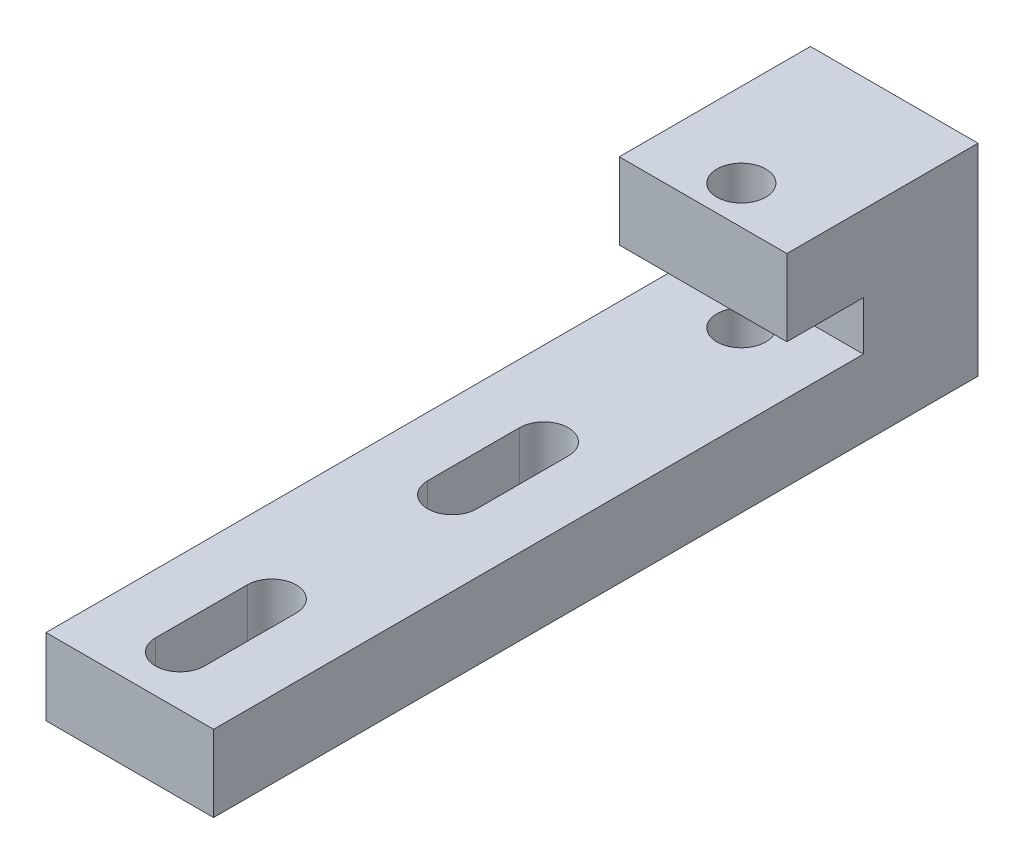
ISO-10303-21;
HEADER;
FILE_DESCRIPTION(('STEP AP214'),'2;1');
FILE_NAME('part.step','',(''),(''),'','','');
FILE_SCHEMA(('AUTOMOTIVE_DESIGN { 1 0 10303 214 1 1 1 1 }'));
ENDSEC;
DATA;
#1=APPLICATION_CONTEXT('core data for automotive mechanical design processes');
#2=APPLICATION_PROTOCOL_DEFINITION('international standard','automotive_design',2000,#1);
#3=PRODUCT_CONTEXT('',#1,'mechanical');
#4=PRODUCT('Part','Part','',(#3));
#5=PRODUCT_RELATED_PRODUCT_CATEGORY('part','',(#4));
#6=PRODUCT_DEFINITION_FORMATION('','',#4);
#7=PRODUCT_DEFINITION_CONTEXT('part definition',#1,'design');
#8=PRODUCT_DEFINITION('design','',#6,#7);
#9=PRODUCT_DEFINITION_SHAPE('','',#8);
#10=(LENGTH_UNIT() NAMED_UNIT(*) SI_UNIT(.MILLI.,.METRE.));
#11=(NAMED_UNIT(*) PLANE_ANGLE_UNIT() SI_UNIT($,.RADIAN.));
#12=(NAMED_UNIT(*) SI_UNIT($,.STERADIAN.) SOLID_ANGLE_UNIT());
#13=UNCERTAINTY_MEASURE_WITH_UNIT(LENGTH_MEASURE(1.E-05),#10,'distance_accuracy_value','');
#14=(GEOMETRIC_REPRESENTATION_CONTEXT(3) GLOBAL_UNCERTAINTY_ASSIGNED_CONTEXT((#13)) GLOBAL_UNIT_ASSIGNED_CONTEXT((#10,
#11,#12)) REPRESENTATION_CONTEXT('',''));
#15=CARTESIAN_POINT('',(0.,0.,0.));
#16=DIRECTION('',(0.,0.,1.));
#17=DIRECTION('',(1.,0.,0.));
#18=AXIS2_PLACEMENT_3D('',#15,#16,#17);
#19=CARTESIAN_POINT('',(0.,13.2,-42.5));
#20=DIRECTION('',(0.,0.,-1.));
#21=DIRECTION('',(-1.,0.,0.));
#22=AXIS2_PLACEMENT_3D('',#19,#20,#21);
#23=PLANE('',#22);
#24=DIRECTION('',(1.,0.,0.));
#25=VECTOR('',#24,1.);
#26=CARTESIAN_POINT('',(0.,8.2,-42.5));
#27=LINE('',#26,#25);
#28=CARTESIAN_POINT('',(0.,8.2,-42.5));
#29=VERTEX_POINT('',#28);
#30=CARTESIAN_POINT('',(10.9621829158617,8.2,-42.5));
#31=VERTEX_POINT('',#30);
#32=EDGE_CURVE('E197',#29,#31,#27,.T.);
#33=ORIENTED_EDGE('',*,*,#32,.F.);
#34=DIRECTION('',(0.,-1.,0.));
#35=VECTOR('',#34,1.);
#36=CARTESIAN_POINT('',(0.,13.2,-42.5));
#37=LINE('',#36,#35);
#38=CARTESIAN_POINT('',(0.,5.,-42.5));
#39=VERTEX_POINT('',#38);
#40=EDGE_CURVE('E58',#29,#39,#37,.T.);
#41=ORIENTED_EDGE('',*,*,#40,.T.);
#42=DIRECTION('',(1.,0.,0.));
#43=VECTOR('',#42,1.);
#44=CARTESIAN_POINT('',(0.,5.,-42.5));
#45=LINE('',#44,#43);
#46=CARTESIAN_POINT('',(10.9621829158617,5.,-42.5));
#47=VERTEX_POINT('',#46);
#48=EDGE_CURVE('E215',#39,#47,#45,.T.);
#49=ORIENTED_EDGE('',*,*,#48,.T.);
#50=DIRECTION('',(0.,-1.,0.));
#51=VECTOR('',#50,1.);
#52=CARTESIAN_POINT('',(10.9621829158617,13.2,-42.5));
#53=LINE('',#52,#51);
#54=EDGE_CURVE('E220',#31,#47,#53,.T.);
#55=ORIENTED_EDGE('',*,*,#54,.F.);
#56=EDGE_LOOP('',(#33,#41,#49,#55));
#57=FACE_BOUND('',#56,.T.);
#58=ADVANCED_FACE('F42',(#57),#23,.F.);
#59=CARTESIAN_POINT('',(0.,5.,0.));
#60=DIRECTION('',(0.,-1.,0.));
#61=DIRECTION('',(0.,0.,-1.));
#62=AXIS2_PLACEMENT_3D('',#59,#60,#61);
#63=PLANE('',#62);
#64=CARTESIAN_POINT('',(5.48109145793085,5.,-40.));
#65=DIRECTION('',(0.,-1.,0.));
#66=DIRECTION('',(0.,0.,-1.));
#67=AXIS2_PLACEMENT_3D('',#64,#65,#66);
#68=CIRCLE('',#67,1.6);
#69=CARTESIAN_POINT('',(5.48109145793085,5.,-41.6));
#70=VERTEX_POINT('',#69);
#71=EDGE_CURVE('E194',#70,#70,#68,.T.);
#72=ORIENTED_EDGE('',*,*,#71,.T.);
#73=EDGE_LOOP('',(#72));
#74=FACE_BOUND('',#73,.T.);
#75=CARTESIAN_POINT('',(5.48109145793086,5.,-3.28548866049899));
#76=DIRECTION('',(0.,1.,0.));
#77=DIRECTION('',(0.,0.,1.));
#78=AXIS2_PLACEMENT_3D('',#75,#76,#77);
#79=CIRCLE('',#78,1.6);
#80=CARTESIAN_POINT('',(3.88109145793085,5.,-3.28548866049899));
#81=VERTEX_POINT('',#80);
#82=CARTESIAN_POINT('',(7.08109145793085,5.,-3.28548866049899));
#83=VERTEX_POINT('',#82);
#84=EDGE_CURVE('E225',#81,#83,#79,.T.);
#85=ORIENTED_EDGE('',*,*,#84,.F.);
#86=DIRECTION('',(0.,0.,1.));
#87=VECTOR('',#86,1.);
#88=CARTESIAN_POINT('',(3.88109145793085,5.,-3.28548866049899));
#89=LINE('',#88,#87);
#90=CARTESIAN_POINT('',(3.88109145793085,5.,-9.28548866049899));
#91=VERTEX_POINT('',#90);
#92=EDGE_CURVE('E232',#91,#81,#89,.T.);
#93=ORIENTED_EDGE('',*,*,#92,.F.);
#94=CARTESIAN_POINT('',(5.48109145793085,5.,-9.28548866049899));
#95=DIRECTION('',(0.,1.,0.));
#96=DIRECTION('',(0.,0.,1.));
#97=AXIS2_PLACEMENT_3D('',#94,#95,#96);
#98=CIRCLE('',#97,1.6);
#99=CARTESIAN_POINT('',(7.08109145793085,5.,-9.28548866049899));
#100=VERTEX_POINT('',#99);
#101=EDGE_CURVE('E230',#100,#91,#98,.T.);
#102=ORIENTED_EDGE('',*,*,#101,.F.);
#103=DIRECTION('',(0.,0.,-1.));
#104=VECTOR('',#103,1.);
#105=CARTESIAN_POINT('',(7.08109145793085,5.,-3.28548866049899));
#106=LINE('',#105,#104);
#107=EDGE_CURVE('E227',#83,#100,#106,.T.);
#108=ORIENTED_EDGE('',*,*,#107,.F.);
#109=EDGE_LOOP('',(#85,#93,#102,#108));
#110=FACE_BOUND('',#109,.T.);
#111=CARTESIAN_POINT('',(5.48109145793085,5.,-27.085488660499));
#112=DIRECTION('',(0.,1.,0.));
#113=DIRECTION('',(0.,0.,1.));
#114=AXIS2_PLACEMENT_3D('',#111,#112,#113);
#115=CIRCLE('',#114,1.6);
#116=CARTESIAN_POINT('',(7.08109145793085,5.,-27.085488660499));
#117=VERTEX_POINT('',#116);
#118=CARTESIAN_POINT('',(3.88109145793085,5.,-27.085488660499));
#119=VERTEX_POINT('',#118);
#120=EDGE_CURVE('E254',#117,#119,#115,.T.);
#121=ORIENTED_EDGE('',*,*,#120,.F.);
#122=DIRECTION('',(0.,0.,-1.));
#123=VECTOR('',#122,1.);
#124=CARTESIAN_POINT('',(7.08109145793085,5.,-27.085488660499));
#125=LINE('',#124,#123);
#126=CARTESIAN_POINT('',(7.08109145793085,5.,-21.085488660499));
#127=VERTEX_POINT('',#126);
#128=EDGE_CURVE('E262',#127,#117,#125,.T.);
#129=ORIENTED_EDGE('',*,*,#128,.F.);
#130=CARTESIAN_POINT('',(5.48109145793085,5.,-21.085488660499));
#131=DIRECTION('',(0.,1.,0.));
#132=DIRECTION('',(0.,0.,1.));
#133=AXIS2_PLACEMENT_3D('',#130,#131,#132);
#134=CIRCLE('',#133,1.6);
#135=CARTESIAN_POINT('',(3.88109145793085,5.,-21.085488660499));
#136=VERTEX_POINT('',#135);
#137=EDGE_CURVE('E259',#136,#127,#134,.T.);
#138=ORIENTED_EDGE('',*,*,#137,.F.);
#139=DIRECTION('',(0.,0.,1.));
#140=VECTOR('',#139,1.);
#141=CARTESIAN_POINT('',(3.88109145793085,5.,-27.085488660499));
#142=LINE('',#141,#140);
#143=EDGE_CURVE('E256',#119,#136,#142,.T.);
#144=ORIENTED_EDGE('',*,*,#143,.F.);
#145=EDGE_LOOP('',(#121,#129,#138,#144));
#146=FACE_BOUND('',#145,.T.);
#147=ORIENTED_EDGE('',*,*,#48,.F.);
#148=DIRECTION('',(0.,0.,1.));
#149=VECTOR('',#148,1.);
#150=CARTESIAN_POINT('',(0.,5.,0.));
#151=LINE('',#150,#149);
#152=CARTESIAN_POINT('',(0.,5.,0.));
#153=VERTEX_POINT('',#152);
#154=EDGE_CURVE('E167',#39,#153,#151,.T.);
#155=ORIENTED_EDGE('',*,*,#154,.T.);
#156=DIRECTION('',(1.,0.,0.));
#157=VECTOR('',#156,1.);
#158=CARTESIAN_POINT('',(0.,5.,0.));
#159=LINE('',#158,#157);
#160=CARTESIAN_POINT('',(10.9621829158617,5.,0.));
#161=VERTEX_POINT('',#160);
#162=EDGE_CURVE('E285',#153,#161,#159,.T.);
#163=ORIENTED_EDGE('',*,*,#162,.T.);
#164=DIRECTION('',(0.,0.,-1.));
#165=VECTOR('',#164,1.);
#166=CARTESIAN_POINT('',(10.9621829158617,5.,0.));
#167=LINE('',#166,#165);
#168=EDGE_CURVE('E287',#161,#47,#167,.T.);
#169=ORIENTED_EDGE('',*,*,#168,.T.);
#170=EDGE_LOOP('',(#147,#155,#163,#169));
#171=FACE_BOUND('',#170,.T.);
#172=ADVANCED_FACE('F311',(#74,#110,#146,#171),#63,.F.);
#173=CARTESIAN_POINT('',(0.,0.,0.));
#174=DIRECTION('',(0.,-1.,0.));
#175=DIRECTION('',(0.,0.,-1.));
#176=AXIS2_PLACEMENT_3D('',#173,#174,#175);
#177=PLANE('',#176);
#178=CARTESIAN_POINT('',(5.48109145793085,0.,-40.));
#179=DIRECTION('',(0.,-1.,0.));
#180=DIRECTION('',(0.,0.,-1.));
#181=AXIS2_PLACEMENT_3D('',#178,#179,#180);
#182=CIRCLE('',#181,1.6);
#183=CARTESIAN_POINT('',(5.48109145793085,0.,-41.6));
#184=VERTEX_POINT('',#183);
#185=EDGE_CURVE('E188',#184,#184,#182,.T.);
#186=ORIENTED_EDGE('',*,*,#185,.F.);
#187=EDGE_LOOP('',(#186));
#188=FACE_BOUND('',#187,.T.);
#189=DIRECTION('',(0.,0.,1.));
#190=VECTOR('',#189,1.);
#191=CARTESIAN_POINT('',(3.88109145793085,0.,-3.28548866049899));
#192=LINE('',#191,#190);
#193=CARTESIAN_POINT('',(3.88109145793085,0.,-9.28548866049899));
#194=VERTEX_POINT('',#193);
#195=CARTESIAN_POINT('',(3.88109145793085,0.,-3.28548866049899));
#196=VERTEX_POINT('',#195);
#197=EDGE_CURVE('E228',#194,#196,#192,.T.);
#198=ORIENTED_EDGE('',*,*,#197,.T.);
#199=CARTESIAN_POINT('',(5.48109145793086,0.,-3.28548866049899));
#200=DIRECTION('',(0.,1.,0.));
#201=DIRECTION('',(0.,0.,1.));
#202=AXIS2_PLACEMENT_3D('',#199,#200,#201);
#203=CIRCLE('',#202,1.6);
#204=CARTESIAN_POINT('',(7.08109145793085,0.,-3.28548866049899));
#205=VERTEX_POINT('',#204);
#206=EDGE_CURVE('E224',#196,#205,#203,.T.);
#207=ORIENTED_EDGE('',*,*,#206,.T.);
#208=DIRECTION('',(0.,0.,-1.));
#209=VECTOR('',#208,1.);
#210=CARTESIAN_POINT('',(7.08109145793085,0.,-3.28548866049899));
#211=LINE('',#210,#209);
#212=CARTESIAN_POINT('',(7.08109145793085,0.,-9.28548866049899));
#213=VERTEX_POINT('',#212);
#214=EDGE_CURVE('E237',#205,#213,#211,.T.);
#215=ORIENTED_EDGE('',*,*,#214,.T.);
#216=CARTESIAN_POINT('',(5.48109145793085,0.,-9.28548866049899));
#217=DIRECTION('',(0.,1.,0.));
#218=DIRECTION('',(0.,0.,1.));
#219=AXIS2_PLACEMENT_3D('',#216,#217,#218);
#220=CIRCLE('',#219,1.6);
#221=EDGE_CURVE('E240',#213,#194,#220,.T.);
#222=ORIENTED_EDGE('',*,*,#221,.T.);
#223=EDGE_LOOP('',(#198,#207,#215,#222));
#224=FACE_BOUND('',#223,.T.);
#225=DIRECTION('',(0.,0.,-1.));
#226=VECTOR('',#225,1.);
#227=CARTESIAN_POINT('',(7.08109145793085,0.,-27.085488660499));
#228=LINE('',#227,#226);
#229=CARTESIAN_POINT('',(7.08109145793085,0.,-21.085488660499));
#230=VERTEX_POINT('',#229);
#231=CARTESIAN_POINT('',(7.08109145793085,0.,-27.085488660499));
#232=VERTEX_POINT('',#231);
#233=EDGE_CURVE('E257',#230,#232,#228,.T.);
#234=ORIENTED_EDGE('',*,*,#233,.T.);
#235=CARTESIAN_POINT('',(5.48109145793085,0.,-27.085488660499));
#236=DIRECTION('',(0.,1.,0.));
#237=DIRECTION('',(0.,0.,1.));
#238=AXIS2_PLACEMENT_3D('',#235,#236,#237);
#239=CIRCLE('',#238,1.6);
#240=CARTESIAN_POINT('',(3.88109145793085,0.,-27.085488660499));
#241=VERTEX_POINT('',#240);
#242=EDGE_CURVE('E253',#232,#241,#239,.T.);
#243=ORIENTED_EDGE('',*,*,#242,.T.);
#244=DIRECTION('',(0.,0.,1.));
#245=VECTOR('',#244,1.);
#246=CARTESIAN_POINT('',(3.88109145793085,0.,-27.085488660499));
#247=LINE('',#246,#245);
#248=CARTESIAN_POINT('',(3.88109145793085,0.,-21.085488660499));
#249=VERTEX_POINT('',#248);
#250=EDGE_CURVE('E267',#241,#249,#247,.T.);
#251=ORIENTED_EDGE('',*,*,#250,.T.);
#252=CARTESIAN_POINT('',(5.48109145793085,0.,-21.085488660499));
#253=DIRECTION('',(0.,1.,0.));
#254=DIRECTION('',(0.,0.,1.));
#255=AXIS2_PLACEMENT_3D('',#252,#253,#254);
#256=CIRCLE('',#255,1.6);
#257=EDGE_CURVE('E270',#249,#230,#256,.T.);
#258=ORIENTED_EDGE('',*,*,#257,.T.);
#259=EDGE_LOOP('',(#234,#243,#251,#258));
#260=FACE_BOUND('',#259,.T.);
#261=DIRECTION('',(0.,0.,1.));
#262=VECTOR('',#261,1.);
#263=CARTESIAN_POINT('',(0.,0.,0.));
#264=LINE('',#263,#262);
#265=CARTESIAN_POINT('',(0.,0.,-50.));
#266=VERTEX_POINT('',#265);
#267=CARTESIAN_POINT('',(0.,0.,0.));
#268=VERTEX_POINT('',#267);
#269=EDGE_CURVE('E174',#266,#268,#264,.T.);
#270=ORIENTED_EDGE('',*,*,#269,.F.);
#271=DIRECTION('',(-1.,0.,0.));
#272=VECTOR('',#271,1.);
#273=CARTESIAN_POINT('',(10.9621829158617,0.,-50.));
#274=LINE('',#273,#272);
#275=CARTESIAN_POINT('',(10.9621829158617,0.,-50.));
#276=VERTEX_POINT('',#275);
#277=EDGE_CURVE('E171',#276,#266,#274,.T.);
#278=ORIENTED_EDGE('',*,*,#277,.F.);
#279=DIRECTION('',(0.,0.,-1.));
#280=VECTOR('',#279,1.);
#281=CARTESIAN_POINT('',(10.9621829158617,0.,0.));
#282=LINE('',#281,#280);
#283=CARTESIAN_POINT('',(10.9621829158617,0.,0.));
#284=VERTEX_POINT('',#283);
#285=EDGE_CURVE('E159',#284,#276,#282,.T.);
#286=ORIENTED_EDGE('',*,*,#285,.F.);
#287=DIRECTION('',(1.,0.,0.));
#288=VECTOR('',#287,1.);
#289=CARTESIAN_POINT('',(0.,0.,0.));
#290=LINE('',#289,#288);
#291=EDGE_CURVE('E168',#268,#284,#290,.T.);
#292=ORIENTED_EDGE('',*,*,#291,.F.);
#293=EDGE_LOOP('',(#270,#278,#286,#292));
#294=FACE_BOUND('',#293,.T.);
#295=ADVANCED_FACE('F172',(#188,#224,#260,#294),#177,.T.);
#296=CARTESIAN_POINT('',(0.,5.,0.));
#297=DIRECTION('',(1.,0.,0.));
#298=DIRECTION('',(0.,0.,-1.));
#299=AXIS2_PLACEMENT_3D('',#296,#297,#298);
#300=PLANE('',#299);
#301=ORIENTED_EDGE('',*,*,#269,.T.);
#302=DIRECTION('',(0.,-1.,0.));
#303=VECTOR('',#302,1.);
#304=CARTESIAN_POINT('',(0.,5.,0.));
#305=LINE('',#304,#303);
#306=EDGE_CURVE('E11',#153,#268,#305,.T.);
#307=ORIENTED_EDGE('',*,*,#306,.F.);
#308=ORIENTED_EDGE('',*,*,#154,.F.);
#309=ORIENTED_EDGE('',*,*,#40,.F.);
#310=DIRECTION('',(0.,0.,-1.));
#311=VECTOR('',#310,1.);
#312=CARTESIAN_POINT('',(0.,8.2,-37.5));
#313=LINE('',#312,#311);
#314=CARTESIAN_POINT('',(0.,8.2,-37.5));
#315=VERTEX_POINT('',#314);
#316=EDGE_CURVE('E213',#315,#29,#313,.T.);
#317=ORIENTED_EDGE('',*,*,#316,.F.);
#318=DIRECTION('',(0.,-1.,0.));
#319=VECTOR('',#318,1.);
#320=CARTESIAN_POINT('',(0.,13.2,-37.5));
#321=LINE('',#320,#319);
#322=CARTESIAN_POINT('',(0.,13.2,-37.5));
#323=VERTEX_POINT('',#322);
#324=EDGE_CURVE('E198',#323,#315,#321,.T.);
#325=ORIENTED_EDGE('',*,*,#324,.F.);
#326=DIRECTION('',(0.,0.,1.));
#327=VECTOR('',#326,1.);
#328=CARTESIAN_POINT('',(0.,13.2,-45.));
#329=LINE('',#328,#327);
#330=CARTESIAN_POINT('',(0.,13.2,-50.));
#331=VERTEX_POINT('',#330);
#332=EDGE_CURVE('E216',#331,#323,#329,.T.);
#333=ORIENTED_EDGE('',*,*,#332,.F.);
#334=DIRECTION('',(0.,1.,0.));
#335=VECTOR('',#334,1.);
#336=CARTESIAN_POINT('',(0.,13.2,-50.));
#337=LINE('',#336,#335);
#338=EDGE_CURVE('E178',#266,#331,#337,.T.);
#339=ORIENTED_EDGE('',*,*,#338,.F.);
#340=EDGE_LOOP('',(#301,#307,#308,#309,#317,#325,#333,#339));
#341=FACE_BOUND('',#340,.T.);
#342=ADVANCED_FACE('F44',(#341),#300,.F.);
#343=CARTESIAN_POINT('',(0.,5.,0.));
#344=DIRECTION('',(0.,0.,-1.));
#345=DIRECTION('',(-1.,0.,0.));
#346=AXIS2_PLACEMENT_3D('',#343,#344,#345);
#347=PLANE('',#346);
#348=ORIENTED_EDGE('',*,*,#291,.T.);
#349=DIRECTION('',(0.,-1.,0.));
#350=VECTOR('',#349,1.);
#351=CARTESIAN_POINT('',(10.9621829158617,5.,0.));
#352=LINE('',#351,#350);
#353=EDGE_CURVE('E51',#161,#284,#352,.T.);
#354=ORIENTED_EDGE('',*,*,#353,.F.);
#355=ORIENTED_EDGE('',*,*,#162,.F.);
#356=ORIENTED_EDGE('',*,*,#306,.T.);
#357=EDGE_LOOP('',(#348,#354,#355,#356));
#358=FACE_BOUND('',#357,.T.);
#359=ADVANCED_FACE('F293',(#358),#347,.F.);
#360=CARTESIAN_POINT('',(10.9621829158617,5.,0.));
#361=DIRECTION('',(-1.,0.,0.));
#362=DIRECTION('',(0.,0.,1.));
#363=AXIS2_PLACEMENT_3D('',#360,#361,#362);
#364=PLANE('',#363);
#365=ORIENTED_EDGE('',*,*,#285,.T.);
#366=DIRECTION('',(0.,-1.,0.));
#367=VECTOR('',#366,1.);
#368=CARTESIAN_POINT('',(10.9621829158617,13.2,-50.));
#369=LINE('',#368,#367);
#370=CARTESIAN_POINT('',(10.9621829158617,13.2,-50.));
#371=VERTEX_POINT('',#370);
#372=EDGE_CURVE('E163',#371,#276,#369,.T.);
#373=ORIENTED_EDGE('',*,*,#372,.F.);
#374=DIRECTION('',(0.,0.,-1.));
#375=VECTOR('',#374,1.);
#376=CARTESIAN_POINT('',(10.9621829158617,13.2,-45.));
#377=LINE('',#376,#375);
#378=CARTESIAN_POINT('',(10.9621829158617,13.2,-37.5));
#379=VERTEX_POINT('',#378);
#380=EDGE_CURVE('E218',#379,#371,#377,.T.);
#381=ORIENTED_EDGE('',*,*,#380,.F.);
#382=DIRECTION('',(0.,1.,0.));
#383=VECTOR('',#382,1.);
#384=CARTESIAN_POINT('',(10.9621829158617,13.2,-37.5));
#385=LINE('',#384,#383);
#386=CARTESIAN_POINT('',(10.9621829158617,8.2,-37.5));
#387=VERTEX_POINT('',#386);
#388=EDGE_CURVE('E203',#387,#379,#385,.T.);
#389=ORIENTED_EDGE('',*,*,#388,.F.);
#390=DIRECTION('',(0.,0.,-1.));
#391=VECTOR('',#390,1.);
#392=CARTESIAN_POINT('',(10.9621829158617,8.2,-37.5));
#393=LINE('',#392,#391);
#394=EDGE_CURVE('E209',#387,#31,#393,.T.);
#395=ORIENTED_EDGE('',*,*,#394,.T.);
#396=ORIENTED_EDGE('',*,*,#54,.T.);
#397=ORIENTED_EDGE('',*,*,#168,.F.);
#398=ORIENTED_EDGE('',*,*,#353,.T.);
#399=EDGE_LOOP('',(#365,#373,#381,#389,#395,#396,#397,#398));
#400=FACE_BOUND('',#399,.T.);
#401=ADVANCED_FACE('F161',(#400),#364,.F.);
#402=CARTESIAN_POINT('',(5.48109145793085,5.,-27.085488660499));
#403=DIRECTION('',(0.,-1.,0.));
#404=DIRECTION('',(0.,0.,-1.));
#405=AXIS2_PLACEMENT_3D('',#402,#403,#404);
#406=CYLINDRICAL_SURFACE('',#405,1.6);
#407=ORIENTED_EDGE('',*,*,#242,.F.);
#408=DIRECTION('',(0.,-1.,0.));
#409=VECTOR('',#408,1.);
#410=CARTESIAN_POINT('',(7.08109145793085,5.,-27.085488660499));
#411=LINE('',#410,#409);
#412=EDGE_CURVE('E264',#117,#232,#411,.T.);
#413=ORIENTED_EDGE('',*,*,#412,.F.);
#414=ORIENTED_EDGE('',*,*,#120,.T.);
#415=DIRECTION('',(0.,-1.,0.));
#416=VECTOR('',#415,1.);
#417=CARTESIAN_POINT('',(3.88109145793085,5.,-27.085488660499));
#418=LINE('',#417,#416);
#419=EDGE_CURVE('E281',#119,#241,#418,.T.);
#420=ORIENTED_EDGE('',*,*,#419,.T.);
#421=EDGE_LOOP('',(#407,#413,#414,#420));
#422=FACE_BOUND('',#421,.T.);
#423=ADVANCED_FACE('F325',(#422),#406,.F.);
#424=CARTESIAN_POINT('',(3.88109145793085,5.,-27.085488660499));
#425=DIRECTION('',(1.,0.,0.));
#426=DIRECTION('',(0.,0.,-1.));
#427=AXIS2_PLACEMENT_3D('',#424,#425,#426);
#428=PLANE('',#427);
#429=ORIENTED_EDGE('',*,*,#250,.F.);
#430=ORIENTED_EDGE('',*,*,#419,.F.);
#431=ORIENTED_EDGE('',*,*,#143,.T.);
#432=DIRECTION('',(0.,-1.,0.));
#433=VECTOR('',#432,1.);
#434=CARTESIAN_POINT('',(3.88109145793085,5.,-21.085488660499));
#435=LINE('',#434,#433);
#436=EDGE_CURVE('E279',#136,#249,#435,.T.);
#437=ORIENTED_EDGE('',*,*,#436,.T.);
#438=EDGE_LOOP('',(#429,#430,#431,#437));
#439=FACE_BOUND('',#438,.T.);
#440=ADVANCED_FACE('F507',(#439),#428,.T.);
#441=CARTESIAN_POINT('',(5.48109145793085,5.,-21.085488660499));
#442=DIRECTION('',(0.,-1.,0.));
#443=DIRECTION('',(0.,0.,-1.));
#444=AXIS2_PLACEMENT_3D('',#441,#442,#443);
#445=CYLINDRICAL_SURFACE('',#444,1.6);
#446=ORIENTED_EDGE('',*,*,#257,.F.);
#447=ORIENTED_EDGE('',*,*,#436,.F.);
#448=ORIENTED_EDGE('',*,*,#137,.T.);
#449=DIRECTION('',(0.,-1.,0.));
#450=VECTOR('',#449,1.);
#451=CARTESIAN_POINT('',(7.08109145793085,5.,-21.085488660499));
#452=LINE('',#451,#450);
#453=EDGE_CURVE('E277',#127,#230,#452,.T.);
#454=ORIENTED_EDGE('',*,*,#453,.T.);
#455=EDGE_LOOP('',(#446,#447,#448,#454));
#456=FACE_BOUND('',#455,.T.);
#457=ADVANCED_FACE('F496',(#456),#445,.F.);
#458=CARTESIAN_POINT('',(7.08109145793085,5.,-27.085488660499));
#459=DIRECTION('',(-1.,0.,0.));
#460=DIRECTION('',(0.,0.,1.));
#461=AXIS2_PLACEMENT_3D('',#458,#459,#460);
#462=PLANE('',#461);
#463=ORIENTED_EDGE('',*,*,#233,.F.);
#464=ORIENTED_EDGE('',*,*,#453,.F.);
#465=ORIENTED_EDGE('',*,*,#128,.T.);
#466=ORIENTED_EDGE('',*,*,#412,.T.);
#467=EDGE_LOOP('',(#463,#464,#465,#466));
#468=FACE_BOUND('',#467,.T.);
#469=ADVANCED_FACE('F485',(#468),#462,.T.);
#470=CARTESIAN_POINT('',(5.48109145793086,5.,-3.28548866049899));
#471=DIRECTION('',(0.,-1.,0.));
#472=DIRECTION('',(0.,0.,-1.));
#473=AXIS2_PLACEMENT_3D('',#470,#471,#472);
#474=CYLINDRICAL_SURFACE('',#473,1.6);
#475=ORIENTED_EDGE('',*,*,#206,.F.);
#476=DIRECTION('',(0.,-1.,0.));
#477=VECTOR('',#476,1.);
#478=CARTESIAN_POINT('',(3.88109145793085,5.,-3.28548866049899));
#479=LINE('',#478,#477);
#480=EDGE_CURVE('E234',#81,#196,#479,.T.);
#481=ORIENTED_EDGE('',*,*,#480,.F.);
#482=ORIENTED_EDGE('',*,*,#84,.T.);
#483=DIRECTION('',(0.,-1.,0.));
#484=VECTOR('',#483,1.);
#485=CARTESIAN_POINT('',(7.08109145793085,5.,-3.28548866049899));
#486=LINE('',#485,#484);
#487=EDGE_CURVE('E250',#83,#205,#486,.T.);
#488=ORIENTED_EDGE('',*,*,#487,.T.);
#489=EDGE_LOOP('',(#475,#481,#482,#488));
#490=FACE_BOUND('',#489,.T.);
#491=ADVANCED_FACE('F474',(#490),#474,.F.);
#492=CARTESIAN_POINT('',(7.08109145793085,5.,-3.28548866049899));
#493=DIRECTION('',(-1.,0.,0.));
#494=DIRECTION('',(0.,0.,1.));
#495=AXIS2_PLACEMENT_3D('',#492,#493,#494);
#496=PLANE('',#495);
#497=ORIENTED_EDGE('',*,*,#214,.F.);
#498=ORIENTED_EDGE('',*,*,#487,.F.);
#499=ORIENTED_EDGE('',*,*,#107,.T.);
#500=DIRECTION('',(0.,-1.,0.));
#501=VECTOR('',#500,1.);
#502=CARTESIAN_POINT('',(7.08109145793085,5.,-9.28548866049899));
#503=LINE('',#502,#501);
#504=EDGE_CURVE('E248',#100,#213,#503,.T.);
#505=ORIENTED_EDGE('',*,*,#504,.T.);
#506=EDGE_LOOP('',(#497,#498,#499,#505));
#507=FACE_BOUND('',#506,.T.);
#508=ADVANCED_FACE('F464',(#507),#496,.T.);
#509=CARTESIAN_POINT('',(5.48109145793085,5.,-9.28548866049899));
#510=DIRECTION('',(0.,-1.,0.));
#511=DIRECTION('',(0.,0.,-1.));
#512=AXIS2_PLACEMENT_3D('',#509,#510,#511);
#513=CYLINDRICAL_SURFACE('',#512,1.6);
#514=ORIENTED_EDGE('',*,*,#221,.F.);
#515=ORIENTED_EDGE('',*,*,#504,.F.);
#516=ORIENTED_EDGE('',*,*,#101,.T.);
#517=DIRECTION('',(0.,-1.,0.));
#518=VECTOR('',#517,1.);
#519=CARTESIAN_POINT('',(3.88109145793085,5.,-9.28548866049899));
#520=LINE('',#519,#518);
#521=EDGE_CURVE('E66',#91,#194,#520,.T.);
#522=ORIENTED_EDGE('',*,*,#521,.T.);
#523=EDGE_LOOP('',(#514,#515,#516,#522));
#524=FACE_BOUND('',#523,.T.);
#525=ADVANCED_FACE('F455',(#524),#513,.F.);
#526=CARTESIAN_POINT('',(3.88109145793085,5.,-3.28548866049899));
#527=DIRECTION('',(1.,0.,0.));
#528=DIRECTION('',(0.,0.,-1.));
#529=AXIS2_PLACEMENT_3D('',#526,#527,#528);
#530=PLANE('',#529);
#531=ORIENTED_EDGE('',*,*,#197,.F.);
#532=ORIENTED_EDGE('',*,*,#521,.F.);
#533=ORIENTED_EDGE('',*,*,#92,.T.);
#534=ORIENTED_EDGE('',*,*,#480,.T.);
#535=EDGE_LOOP('',(#531,#532,#533,#534));
#536=FACE_BOUND('',#535,.T.);
#537=ADVANCED_FACE('F348',(#536),#530,.T.);
#538=CARTESIAN_POINT('',(0.,13.2,0.));
#539=DIRECTION('',(0.,1.,0.));
#540=DIRECTION('',(0.,0.,1.));
#541=AXIS2_PLACEMENT_3D('',#538,#539,#540);
#542=PLANE('',#541);
#543=CARTESIAN_POINT('',(5.48109145793085,13.2,-40.));
#544=DIRECTION('',(0.,-1.,0.));
#545=DIRECTION('',(0.,0.,-1.));
#546=AXIS2_PLACEMENT_3D('',#543,#544,#545);
#547=CIRCLE('',#546,1.6);
#548=CARTESIAN_POINT('',(5.48109145793085,13.2,-41.6));
#549=VERTEX_POINT('',#548);
#550=EDGE_CURVE('E191',#549,#549,#547,.T.);
#551=ORIENTED_EDGE('',*,*,#550,.T.);
#552=EDGE_LOOP('',(#551));
#553=FACE_BOUND('',#552,.T.);
#554=ORIENTED_EDGE('',*,*,#332,.T.);
#555=DIRECTION('',(-1.,0.,0.));
#556=VECTOR('',#555,1.);
#557=CARTESIAN_POINT('',(0.,13.2,-37.5));
#558=LINE('',#557,#556);
#559=EDGE_CURVE('E206',#379,#323,#558,.T.);
#560=ORIENTED_EDGE('',*,*,#559,.F.);
#561=ORIENTED_EDGE('',*,*,#380,.T.);
#562=DIRECTION('',(1.,0.,0.));
#563=VECTOR('',#562,1.);
#564=CARTESIAN_POINT('',(10.9621829158617,13.2,-50.));
#565=LINE('',#564,#563);
#566=EDGE_CURVE('E183',#331,#371,#565,.T.);
#567=ORIENTED_EDGE('',*,*,#566,.F.);
#568=EDGE_LOOP('',(#554,#560,#561,#567));
#569=FACE_BOUND('',#568,.T.);
#570=ADVANCED_FACE('F300',(#553,#569),#542,.T.);
#571=CARTESIAN_POINT('',(0.,8.2,-37.5));
#572=DIRECTION('',(0.,1.,0.));
#573=DIRECTION('',(0.,0.,1.));
#574=AXIS2_PLACEMENT_3D('',#571,#572,#573);
#575=PLANE('',#574);
#576=CARTESIAN_POINT('',(5.48109145793085,8.2,-40.));
#577=DIRECTION('',(0.,1.,0.));
#578=DIRECTION('',(0.,0.,1.));
#579=AXIS2_PLACEMENT_3D('',#576,#577,#578);
#580=CIRCLE('',#579,1.6);
#581=CARTESIAN_POINT('',(5.48109145793085,8.2,-38.4));
#582=VERTEX_POINT('',#581);
#583=EDGE_CURVE('E46',#582,#582,#580,.T.);
#584=ORIENTED_EDGE('',*,*,#583,.T.);
#585=EDGE_LOOP('',(#584));
#586=FACE_BOUND('',#585,.T.);
#587=ORIENTED_EDGE('',*,*,#32,.T.);
#588=ORIENTED_EDGE('',*,*,#394,.F.);
#589=DIRECTION('',(1.,0.,0.));
#590=VECTOR('',#589,1.);
#591=CARTESIAN_POINT('',(0.,8.2,-37.5));
#592=LINE('',#591,#590);
#593=EDGE_CURVE('E201',#315,#387,#592,.T.);
#594=ORIENTED_EDGE('',*,*,#593,.F.);
#595=ORIENTED_EDGE('',*,*,#316,.T.);
#596=EDGE_LOOP('',(#587,#588,#594,#595));
#597=FACE_BOUND('',#596,.T.);
#598=ADVANCED_FACE('F308',(#586,#597),#575,.F.);
#599=CARTESIAN_POINT('',(0.,0.,-37.5));
#600=DIRECTION('',(0.,0.,1.));
#601=DIRECTION('',(1.,0.,0.));
#602=AXIS2_PLACEMENT_3D('',#599,#600,#601);
#603=PLANE('',#602);
#604=ORIENTED_EDGE('',*,*,#324,.T.);
#605=ORIENTED_EDGE('',*,*,#593,.T.);
#606=ORIENTED_EDGE('',*,*,#388,.T.);
#607=ORIENTED_EDGE('',*,*,#559,.T.);
#608=EDGE_LOOP('',(#604,#605,#606,#607));
#609=FACE_BOUND('',#608,.T.);
#610=ADVANCED_FACE('F304',(#609),#603,.T.);
#611=CARTESIAN_POINT('',(5.48109145793085,13.2,-40.));
#612=DIRECTION('',(0.,-1.,0.));
#613=DIRECTION('',(0.,0.,-1.));
#614=AXIS2_PLACEMENT_3D('',#611,#612,#613);
#615=CYLINDRICAL_SURFACE('',#614,1.6);
#616=ORIENTED_EDGE('',*,*,#550,.F.);
#617=EDGE_LOOP('',(#616));
#618=FACE_BOUND('',#617,.T.);
#619=ORIENTED_EDGE('',*,*,#583,.F.);
#620=EDGE_LOOP('',(#619));
#621=FACE_BOUND('',#620,.T.);
#622=ADVANCED_FACE('F398',(#618,#621),#615,.F.);
#623=ORIENTED_EDGE('',*,*,#185,.T.);
#624=EDGE_LOOP('',(#623));
#625=FACE_BOUND('',#624,.T.);
#626=ORIENTED_EDGE('',*,*,#71,.F.);
#627=EDGE_LOOP('',(#626));
#628=FACE_BOUND('',#627,.T.);
#629=ADVANCED_FACE('F355',(#625,#628),#615,.F.);
#630=CARTESIAN_POINT('',(0.,0.,-50.));
#631=DIRECTION('',(0.,0.,-1.));
#632=DIRECTION('',(-1.,0.,0.));
#633=AXIS2_PLACEMENT_3D('',#630,#631,#632);
#634=PLANE('',#633);
#635=ORIENTED_EDGE('',*,*,#372,.T.);
#636=ORIENTED_EDGE('',*,*,#277,.T.);
#637=ORIENTED_EDGE('',*,*,#338,.T.);
#638=ORIENTED_EDGE('',*,*,#566,.T.);
#639=EDGE_LOOP('',(#635,#636,#637,#638));
#640=FACE_BOUND('',#639,.T.);
#641=ADVANCED_FACE('F181',(#640),#634,.T.);
#642=CLOSED_SHELL('',(#58,#172,#295,#342,#359,#401,#423,#440,#457,#469,#491,#508,#525,#537,#570,
#598,#610,#622,#629,#641));
#643=MANIFOLD_SOLID_BREP('B2',#642);
#644=ADVANCED_BREP_SHAPE_REPRESENTATION('',(#18,#643),#14);
#645=SHAPE_DEFINITION_REPRESENTATION(#9,#644);
ENDSEC;
END-ISO-10303-21;
